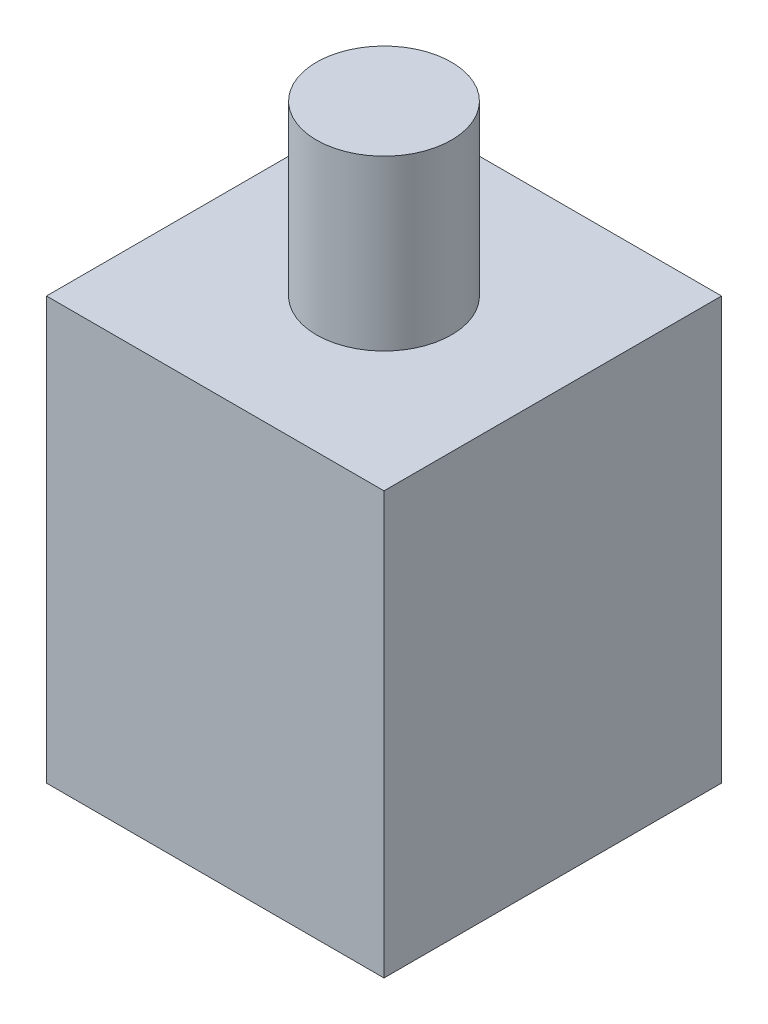
ISO-10303-21;
HEADER;
FILE_DESCRIPTION(('STEP AP214'),'2;1');
FILE_NAME('part.step','',(''),(''),'','','');
FILE_SCHEMA(('AUTOMOTIVE_DESIGN { 1 0 10303 214 1 1 1 1 }'));
ENDSEC;
DATA;
#1=APPLICATION_CONTEXT('core data for automotive mechanical design processes');
#2=APPLICATION_PROTOCOL_DEFINITION('international standard','automotive_design',2000,#1);
#3=PRODUCT_CONTEXT('',#1,'mechanical');
#4=PRODUCT('Part','Part','',(#3));
#5=PRODUCT_RELATED_PRODUCT_CATEGORY('part','',(#4));
#6=PRODUCT_DEFINITION_FORMATION('','',#4);
#7=PRODUCT_DEFINITION_CONTEXT('part definition',#1,'design');
#8=PRODUCT_DEFINITION('design','',#6,#7);
#9=PRODUCT_DEFINITION_SHAPE('','',#8);
#10=(LENGTH_UNIT() NAMED_UNIT(*) SI_UNIT(.MILLI.,.METRE.));
#11=(NAMED_UNIT(*) PLANE_ANGLE_UNIT() SI_UNIT($,.RADIAN.));
#12=(NAMED_UNIT(*) SI_UNIT($,.STERADIAN.) SOLID_ANGLE_UNIT());
#13=UNCERTAINTY_MEASURE_WITH_UNIT(LENGTH_MEASURE(1.E-05),#10,'distance_accuracy_value','');
#14=(GEOMETRIC_REPRESENTATION_CONTEXT(3) GLOBAL_UNCERTAINTY_ASSIGNED_CONTEXT((#13)) GLOBAL_UNIT_ASSIGNED_CONTEXT((#10,
#11,#12)) REPRESENTATION_CONTEXT('',''));
#15=CARTESIAN_POINT('',(0.,0.,0.));
#16=DIRECTION('',(0.,0.,1.));
#17=DIRECTION('',(1.,0.,0.));
#18=AXIS2_PLACEMENT_3D('',#15,#16,#17);
#19=CARTESIAN_POINT('',(0.,70.,0.));
#20=DIRECTION('',(0.,-1.,0.));
#21=DIRECTION('',(0.,0.,-1.));
#22=AXIS2_PLACEMENT_3D('',#19,#20,#21);
#23=CYLINDRICAL_SURFACE('',#22,8.);
#24=CARTESIAN_POINT('',(0.,70.,0.));
#25=DIRECTION('',(0.,1.,0.));
#26=DIRECTION('',(0.,0.,1.));
#27=AXIS2_PLACEMENT_3D('',#24,#25,#26);
#28=CIRCLE('',#27,8.);
#29=CARTESIAN_POINT('',(0.,70.,8.));
#30=VERTEX_POINT('',#29);
#31=EDGE_CURVE('E11',#30,#30,#28,.T.);
#32=ORIENTED_EDGE('',*,*,#31,.F.);
#33=EDGE_LOOP('',(#32));
#34=FACE_BOUND('',#33,.T.);
#35=CARTESIAN_POINT('',(0.,50.,0.));
#36=DIRECTION('',(0.,1.,0.));
#37=DIRECTION('',(0.,0.,1.));
#38=AXIS2_PLACEMENT_3D('',#35,#36,#37);
#39=CIRCLE('',#38,8.);
#40=CARTESIAN_POINT('',(0.,50.,8.));
#41=VERTEX_POINT('',#40);
#42=EDGE_CURVE('E52',#41,#41,#39,.T.);
#43=ORIENTED_EDGE('',*,*,#42,.T.);
#44=EDGE_LOOP('',(#43));
#45=FACE_BOUND('',#44,.T.);
#46=ADVANCED_FACE('F49',(#34,#45),#23,.T.);
#47=CARTESIAN_POINT('',(0.,70.,0.));
#48=DIRECTION('',(0.,1.,0.));
#49=DIRECTION('',(0.,0.,1.));
#50=AXIS2_PLACEMENT_3D('',#47,#48,#49);
#51=PLANE('',#50);
#52=ORIENTED_EDGE('',*,*,#31,.T.);
#53=EDGE_LOOP('',(#52));
#54=FACE_BOUND('',#53,.T.);
#55=ADVANCED_FACE('F64',(#54),#51,.T.);
#56=CARTESIAN_POINT('',(0.,50.,0.));
#57=DIRECTION('',(0.,1.,0.));
#58=DIRECTION('',(0.,0.,1.));
#59=AXIS2_PLACEMENT_3D('',#56,#57,#58);
#60=PLANE('',#59);
#61=ORIENTED_EDGE('',*,*,#42,.F.);
#62=EDGE_LOOP('',(#61));
#63=FACE_BOUND('',#62,.T.);
#64=ADVANCED_FACE('F62',(#63),#60,.F.);
#65=CLOSED_SHELL('',(#46,#55,#64));
#66=MANIFOLD_SOLID_BREP('B2',#65);
#67=CARTESIAN_POINT('',(20.,50.,-20.));
#68=DIRECTION('',(-1.,0.,0.));
#69=DIRECTION('',(0.,0.,1.));
#70=AXIS2_PLACEMENT_3D('',#67,#68,#69);
#71=PLANE('',#70);
#72=DIRECTION('',(0.,0.,-1.));
#73=VECTOR('',#72,1.);
#74=CARTESIAN_POINT('',(20.,0.,-20.));
#75=LINE('',#74,#73);
#76=CARTESIAN_POINT('',(20.,0.,20.));
#77=VERTEX_POINT('',#76);
#78=CARTESIAN_POINT('',(20.,0.,-20.));
#79=VERTEX_POINT('',#78);
#80=EDGE_CURVE('E159',#77,#79,#75,.T.);
#81=ORIENTED_EDGE('',*,*,#80,.T.);
#82=DIRECTION('',(0.,-1.,0.));
#83=VECTOR('',#82,1.);
#84=CARTESIAN_POINT('',(20.,50.,-20.));
#85=LINE('',#84,#83);
#86=CARTESIAN_POINT('',(20.,50.,-20.));
#87=VERTEX_POINT('',#86);
#88=EDGE_CURVE('E47',#87,#79,#85,.T.);
#89=ORIENTED_EDGE('',*,*,#88,.F.);
#90=DIRECTION('',(0.,0.,-1.));
#91=VECTOR('',#90,1.);
#92=CARTESIAN_POINT('',(20.,50.,-20.));
#93=LINE('',#92,#91);
#94=CARTESIAN_POINT('',(20.,50.,20.));
#95=VERTEX_POINT('',#94);
#96=EDGE_CURVE('E147',#95,#87,#93,.T.);
#97=ORIENTED_EDGE('',*,*,#96,.F.);
#98=DIRECTION('',(0.,-1.,0.));
#99=VECTOR('',#98,1.);
#100=CARTESIAN_POINT('',(20.,50.,20.));
#101=LINE('',#100,#99);
#102=EDGE_CURVE('E155',#95,#77,#101,.T.);
#103=ORIENTED_EDGE('',*,*,#102,.T.);
#104=EDGE_LOOP('',(#81,#89,#97,#103));
#105=FACE_BOUND('',#104,.T.);
#106=ADVANCED_FACE('F96',(#105),#71,.F.);
#107=CARTESIAN_POINT('',(-20.,50.,-20.));
#108=DIRECTION('',(0.,0.,1.));
#109=DIRECTION('',(1.,0.,0.));
#110=AXIS2_PLACEMENT_3D('',#107,#108,#109);
#111=PLANE('',#110);
#112=DIRECTION('',(-1.,0.,0.));
#113=VECTOR('',#112,1.);
#114=CARTESIAN_POINT('',(-20.,0.,-20.));
#115=LINE('',#114,#113);
#116=CARTESIAN_POINT('',(-20.,0.,-20.));
#117=VERTEX_POINT('',#116);
#118=EDGE_CURVE('E151',#79,#117,#115,.T.);
#119=ORIENTED_EDGE('',*,*,#118,.T.);
#120=DIRECTION('',(0.,-1.,0.));
#121=VECTOR('',#120,1.);
#122=CARTESIAN_POINT('',(-20.,50.,-20.));
#123=LINE('',#122,#121);
#124=CARTESIAN_POINT('',(-20.,50.,-20.));
#125=VERTEX_POINT('',#124);
#126=EDGE_CURVE('E104',#125,#117,#123,.T.);
#127=ORIENTED_EDGE('',*,*,#126,.F.);
#128=DIRECTION('',(-1.,0.,0.));
#129=VECTOR('',#128,1.);
#130=CARTESIAN_POINT('',(-20.,50.,-20.));
#131=LINE('',#130,#129);
#132=EDGE_CURVE('E142',#87,#125,#131,.T.);
#133=ORIENTED_EDGE('',*,*,#132,.F.);
#134=ORIENTED_EDGE('',*,*,#88,.T.);
#135=EDGE_LOOP('',(#119,#127,#133,#134));
#136=FACE_BOUND('',#135,.T.);
#137=ADVANCED_FACE('F150',(#136),#111,.F.);
#138=CARTESIAN_POINT('',(-20.,50.,-20.));
#139=DIRECTION('',(1.,0.,0.));
#140=DIRECTION('',(0.,0.,-1.));
#141=AXIS2_PLACEMENT_3D('',#138,#139,#140);
#142=PLANE('',#141);
#143=DIRECTION('',(0.,0.,1.));
#144=VECTOR('',#143,1.);
#145=CARTESIAN_POINT('',(-20.,0.,-20.));
#146=LINE('',#145,#144);
#147=CARTESIAN_POINT('',(-20.,0.,20.));
#148=VERTEX_POINT('',#147);
#149=EDGE_CURVE('E129',#117,#148,#146,.T.);
#150=ORIENTED_EDGE('',*,*,#149,.T.);
#151=DIRECTION('',(0.,-1.,0.));
#152=VECTOR('',#151,1.);
#153=CARTESIAN_POINT('',(-20.,50.,20.));
#154=LINE('',#153,#152);
#155=CARTESIAN_POINT('',(-20.,50.,20.));
#156=VERTEX_POINT('',#155);
#157=EDGE_CURVE('E152',#156,#148,#154,.T.);
#158=ORIENTED_EDGE('',*,*,#157,.F.);
#159=DIRECTION('',(0.,0.,1.));
#160=VECTOR('',#159,1.);
#161=CARTESIAN_POINT('',(-20.,50.,-20.));
#162=LINE('',#161,#160);
#163=EDGE_CURVE('E145',#125,#156,#162,.T.);
#164=ORIENTED_EDGE('',*,*,#163,.F.);
#165=ORIENTED_EDGE('',*,*,#126,.T.);
#166=EDGE_LOOP('',(#150,#158,#164,#165));
#167=FACE_BOUND('',#166,.T.);
#168=ADVANCED_FACE('F153',(#167),#142,.F.);
#169=CARTESIAN_POINT('',(-20.,50.,20.));
#170=DIRECTION('',(0.,0.,-1.));
#171=DIRECTION('',(-1.,0.,0.));
#172=AXIS2_PLACEMENT_3D('',#169,#170,#171);
#173=PLANE('',#172);
#174=DIRECTION('',(1.,0.,0.));
#175=VECTOR('',#174,1.);
#176=CARTESIAN_POINT('',(-20.,0.,20.));
#177=LINE('',#176,#175);
#178=EDGE_CURVE('E135',#148,#77,#177,.T.);
#179=ORIENTED_EDGE('',*,*,#178,.T.);
#180=ORIENTED_EDGE('',*,*,#102,.F.);
#181=DIRECTION('',(1.,0.,0.));
#182=VECTOR('',#181,1.);
#183=CARTESIAN_POINT('',(-20.,50.,20.));
#184=LINE('',#183,#182);
#185=EDGE_CURVE('E112',#156,#95,#184,.T.);
#186=ORIENTED_EDGE('',*,*,#185,.F.);
#187=ORIENTED_EDGE('',*,*,#157,.T.);
#188=EDGE_LOOP('',(#179,#180,#186,#187));
#189=FACE_BOUND('',#188,.T.);
#190=ADVANCED_FACE('F166',(#189),#173,.F.);
#191=CARTESIAN_POINT('',(0.,50.,0.));
#192=DIRECTION('',(0.,1.,0.));
#193=DIRECTION('',(0.,0.,1.));
#194=AXIS2_PLACEMENT_3D('',#191,#192,#193);
#195=PLANE('',#194);
#196=ORIENTED_EDGE('',*,*,#96,.T.);
#197=ORIENTED_EDGE('',*,*,#132,.T.);
#198=ORIENTED_EDGE('',*,*,#163,.T.);
#199=ORIENTED_EDGE('',*,*,#185,.T.);
#200=EDGE_LOOP('',(#196,#197,#198,#199));
#201=FACE_BOUND('',#200,.T.);
#202=ADVANCED_FACE('F143',(#201),#195,.T.);
#203=CARTESIAN_POINT('',(0.,0.,0.));
#204=DIRECTION('',(0.,1.,0.));
#205=DIRECTION('',(0.,0.,1.));
#206=AXIS2_PLACEMENT_3D('',#203,#204,#205);
#207=PLANE('',#206);
#208=ORIENTED_EDGE('',*,*,#80,.F.);
#209=ORIENTED_EDGE('',*,*,#178,.F.);
#210=ORIENTED_EDGE('',*,*,#149,.F.);
#211=ORIENTED_EDGE('',*,*,#118,.F.);
#212=EDGE_LOOP('',(#208,#209,#210,#211));
#213=FACE_BOUND('',#212,.T.);
#214=ADVANCED_FACE('F169',(#213),#207,.F.);
#215=CLOSED_SHELL('',(#106,#137,#168,#190,#202,#214));
#216=MANIFOLD_SOLID_BREP('B6',#215);
#217=ADVANCED_BREP_SHAPE_REPRESENTATION('',(#18,#66,#216),#14);
#218=SHAPE_DEFINITION_REPRESENTATION(#9,#217);
ENDSEC;
END-ISO-10303-21;
